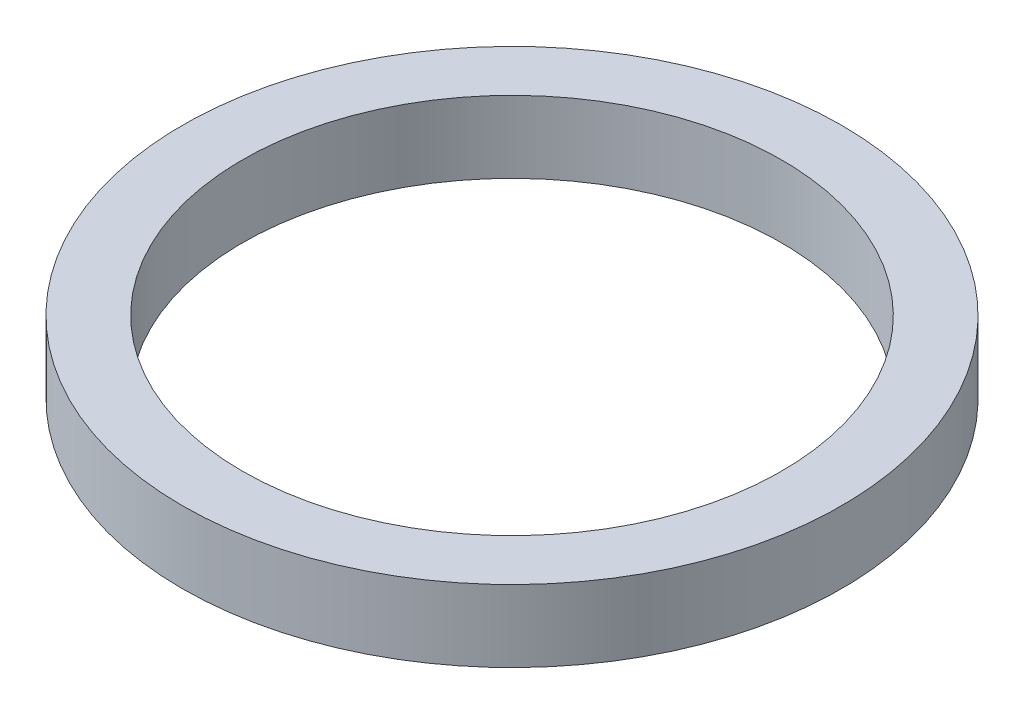
ISO-10303-21;
HEADER;
FILE_DESCRIPTION(('STEP AP214'),'2;1');
FILE_NAME('part.step','',(''),(''),'','','');
FILE_SCHEMA(('AUTOMOTIVE_DESIGN { 1 0 10303 214 1 1 1 1 }'));
ENDSEC;
DATA;
#1=APPLICATION_CONTEXT('core data for automotive mechanical design processes');
#2=APPLICATION_PROTOCOL_DEFINITION('international standard','automotive_design',2000,#1);
#3=PRODUCT_CONTEXT('',#1,'mechanical');
#4=PRODUCT('Part','Part','',(#3));
#5=PRODUCT_RELATED_PRODUCT_CATEGORY('part','',(#4));
#6=PRODUCT_DEFINITION_FORMATION('','',#4);
#7=PRODUCT_DEFINITION_CONTEXT('part definition',#1,'design');
#8=PRODUCT_DEFINITION('design','',#6,#7);
#9=PRODUCT_DEFINITION_SHAPE('','',#8);
#10=(LENGTH_UNIT() NAMED_UNIT(*) SI_UNIT(.MILLI.,.METRE.));
#11=(NAMED_UNIT(*) PLANE_ANGLE_UNIT() SI_UNIT($,.RADIAN.));
#12=(NAMED_UNIT(*) SI_UNIT($,.STERADIAN.) SOLID_ANGLE_UNIT());
#13=UNCERTAINTY_MEASURE_WITH_UNIT(LENGTH_MEASURE(1.E-05),#10,'distance_accuracy_value','');
#14=(GEOMETRIC_REPRESENTATION_CONTEXT(3) GLOBAL_UNCERTAINTY_ASSIGNED_CONTEXT((#13)) GLOBAL_UNIT_ASSIGNED_CONTEXT((#10,
#11,#12)) REPRESENTATION_CONTEXT('',''));
#15=CARTESIAN_POINT('',(0.,0.,0.));
#16=DIRECTION('',(0.,0.,1.));
#17=DIRECTION('',(1.,0.,0.));
#18=AXIS2_PLACEMENT_3D('',#15,#16,#17);
#19=CARTESIAN_POINT('',(0.,3.,0.));
#20=DIRECTION('',(0.,1.,0.));
#21=DIRECTION('',(0.,0.,1.));
#22=AXIS2_PLACEMENT_3D('',#19,#20,#21);
#23=PLANE('',#22);
#24=CARTESIAN_POINT('',(0.,3.,0.));
#25=DIRECTION('',(0.,1.,0.));
#26=DIRECTION('',(0.,0.,1.));
#27=AXIS2_PLACEMENT_3D('',#24,#25,#26);
#28=CIRCLE('',#27,27.5);
#29=CARTESIAN_POINT('',(0.,3.,27.5));
#30=VERTEX_POINT('',#29);
#31=EDGE_CURVE('E10',#30,#30,#28,.T.);
#32=ORIENTED_EDGE('',*,*,#31,.T.);
#33=EDGE_LOOP('',(#32));
#34=FACE_BOUND('',#33,.T.);
#35=CARTESIAN_POINT('',(0.,3.,0.));
#36=DIRECTION('',(0.,1.,0.));
#37=DIRECTION('',(0.,0.,1.));
#38=AXIS2_PLACEMENT_3D('',#35,#36,#37);
#39=CIRCLE('',#38,22.5);
#40=CARTESIAN_POINT('',(0.,3.,22.5));
#41=VERTEX_POINT('',#40);
#42=EDGE_CURVE('E44',#41,#41,#39,.T.);
#43=ORIENTED_EDGE('',*,*,#42,.F.);
#44=EDGE_LOOP('',(#43));
#45=FACE_BOUND('',#44,.T.);
#46=ADVANCED_FACE('F33',(#34,#45),#23,.T.);
#47=CARTESIAN_POINT('',(0.,-3.,0.));
#48=DIRECTION('',(0.,1.,0.));
#49=DIRECTION('',(0.,0.,1.));
#50=AXIS2_PLACEMENT_3D('',#47,#48,#49);
#51=PLANE('',#50);
#52=CARTESIAN_POINT('',(0.,-3.,0.));
#53=DIRECTION('',(0.,1.,0.));
#54=DIRECTION('',(0.,0.,1.));
#55=AXIS2_PLACEMENT_3D('',#52,#53,#54);
#56=CIRCLE('',#55,27.5);
#57=CARTESIAN_POINT('',(0.,-3.,27.5));
#58=VERTEX_POINT('',#57);
#59=EDGE_CURVE('E37',#58,#58,#56,.T.);
#60=ORIENTED_EDGE('',*,*,#59,.F.);
#61=EDGE_LOOP('',(#60));
#62=FACE_BOUND('',#61,.T.);
#63=CARTESIAN_POINT('',(0.,-3.,0.));
#64=DIRECTION('',(0.,1.,0.));
#65=DIRECTION('',(0.,0.,1.));
#66=AXIS2_PLACEMENT_3D('',#63,#64,#65);
#67=CIRCLE('',#66,22.5);
#68=CARTESIAN_POINT('',(0.,-3.,22.5));
#69=VERTEX_POINT('',#68);
#70=EDGE_CURVE('E46',#69,#69,#67,.T.);
#71=ORIENTED_EDGE('',*,*,#70,.T.);
#72=EDGE_LOOP('',(#71));
#73=FACE_BOUND('',#72,.T.);
#74=ADVANCED_FACE('F56',(#62,#73),#51,.F.);
#75=CARTESIAN_POINT('',(0.,3.,0.));
#76=DIRECTION('',(0.,-1.,0.));
#77=DIRECTION('',(0.,0.,-1.));
#78=AXIS2_PLACEMENT_3D('',#75,#76,#77);
#79=CYLINDRICAL_SURFACE('',#78,27.5);
#80=ORIENTED_EDGE('',*,*,#31,.F.);
#81=EDGE_LOOP('',(#80));
#82=FACE_BOUND('',#81,.T.);
#83=ORIENTED_EDGE('',*,*,#59,.T.);
#84=EDGE_LOOP('',(#83));
#85=FACE_BOUND('',#84,.T.);
#86=ADVANCED_FACE('F35',(#82,#85),#79,.T.);
#87=CARTESIAN_POINT('',(0.,3.,0.));
#88=DIRECTION('',(0.,-1.,0.));
#89=DIRECTION('',(0.,0.,-1.));
#90=AXIS2_PLACEMENT_3D('',#87,#88,#89);
#91=CYLINDRICAL_SURFACE('',#90,22.5);
#92=ORIENTED_EDGE('',*,*,#42,.T.);
#93=EDGE_LOOP('',(#92));
#94=FACE_BOUND('',#93,.T.);
#95=ORIENTED_EDGE('',*,*,#70,.F.);
#96=EDGE_LOOP('',(#95));
#97=FACE_BOUND('',#96,.T.);
#98=ADVANCED_FACE('F52',(#94,#97),#91,.F.);
#99=CLOSED_SHELL('',(#46,#74,#86,#98));
#100=MANIFOLD_SOLID_BREP('B2',#99);
#101=ADVANCED_BREP_SHAPE_REPRESENTATION('',(#18,#100),#14);
#102=SHAPE_DEFINITION_REPRESENTATION(#9,#101);
ENDSEC;
END-ISO-10303-21;
